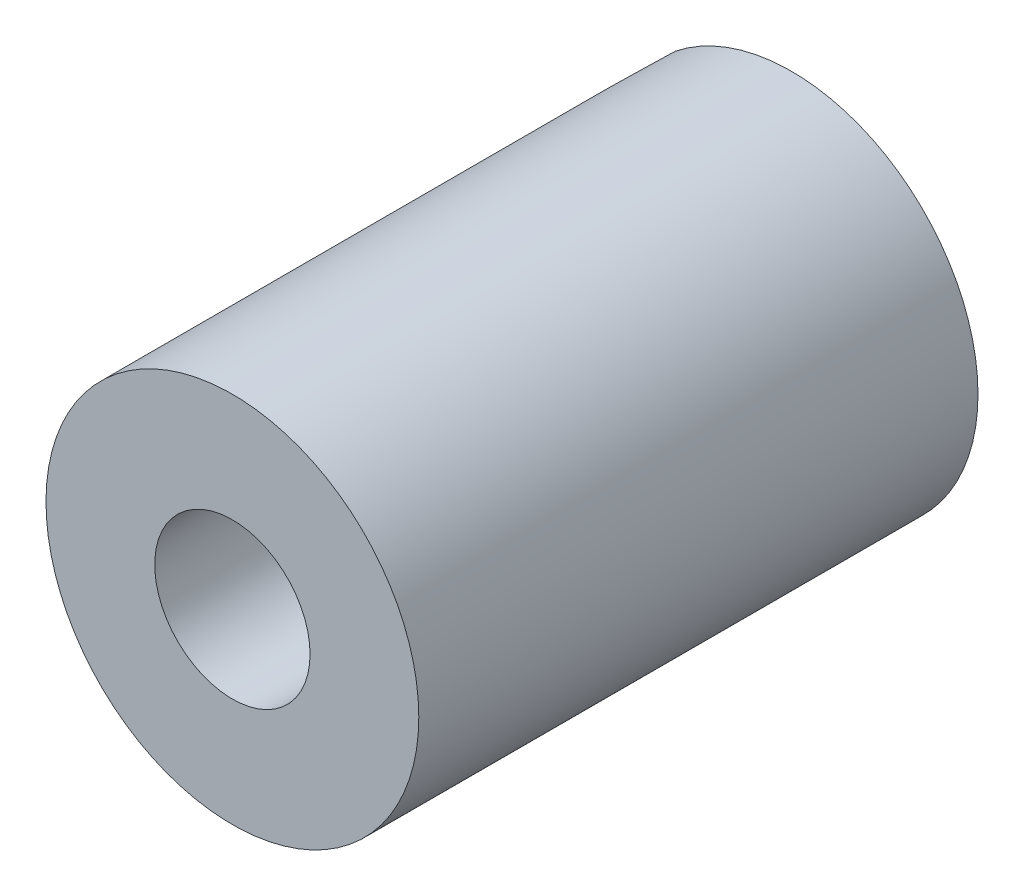
ISO-10303-21;
HEADER;
FILE_DESCRIPTION(('STEP AP214'),'2;1');
FILE_NAME('part.step','',(''),(''),'','','');
FILE_SCHEMA(('AUTOMOTIVE_DESIGN { 1 0 10303 214 1 1 1 1 }'));
ENDSEC;
DATA;
#1=APPLICATION_CONTEXT('core data for automotive mechanical design processes');
#2=APPLICATION_PROTOCOL_DEFINITION('international standard','automotive_design',2000,#1);
#3=PRODUCT_CONTEXT('',#1,'mechanical');
#4=PRODUCT('Part','Part','',(#3));
#5=PRODUCT_RELATED_PRODUCT_CATEGORY('part','',(#4));
#6=PRODUCT_DEFINITION_FORMATION('','',#4);
#7=PRODUCT_DEFINITION_CONTEXT('part definition',#1,'design');
#8=PRODUCT_DEFINITION('design','',#6,#7);
#9=PRODUCT_DEFINITION_SHAPE('','',#8);
#10=(LENGTH_UNIT() NAMED_UNIT(*) SI_UNIT(.MILLI.,.METRE.));
#11=(NAMED_UNIT(*) PLANE_ANGLE_UNIT() SI_UNIT($,.RADIAN.));
#12=(NAMED_UNIT(*) SI_UNIT($,.STERADIAN.) SOLID_ANGLE_UNIT());
#13=UNCERTAINTY_MEASURE_WITH_UNIT(LENGTH_MEASURE(1.E-05),#10,'distance_accuracy_value','');
#14=(GEOMETRIC_REPRESENTATION_CONTEXT(3) GLOBAL_UNCERTAINTY_ASSIGNED_CONTEXT((#13)) GLOBAL_UNIT_ASSIGNED_CONTEXT((#10,
#11,#12)) REPRESENTATION_CONTEXT('',''));
#15=CARTESIAN_POINT('',(0.,0.,0.));
#16=DIRECTION('',(0.,0.,1.));
#17=DIRECTION('',(1.,0.,0.));
#18=AXIS2_PLACEMENT_3D('',#15,#16,#17);
#19=CARTESIAN_POINT('',(0.,0.,9.));
#20=DIRECTION('',(0.,0.,1.));
#21=DIRECTION('',(1.,0.,0.));
#22=AXIS2_PLACEMENT_3D('',#19,#20,#21);
#23=PLANE('',#22);
#24=CARTESIAN_POINT('',(0.,0.,9.));
#25=DIRECTION('',(0.,0.,1.));
#26=DIRECTION('',(1.,0.,0.));
#27=AXIS2_PLACEMENT_3D('',#24,#25,#26);
#28=CIRCLE('',#27,3.);
#29=CARTESIAN_POINT('',(3.,0.,9.));
#30=VERTEX_POINT('',#29);
#31=EDGE_CURVE('E47',#30,#30,#28,.T.);
#32=ORIENTED_EDGE('',*,*,#31,.T.);
#33=EDGE_LOOP('',(#32));
#34=FACE_BOUND('',#33,.T.);
#35=CARTESIAN_POINT('',(0.,0.,9.));
#36=DIRECTION('',(0.,0.,1.));
#37=DIRECTION('',(1.,0.,0.));
#38=AXIS2_PLACEMENT_3D('',#35,#36,#37);
#39=CIRCLE('',#38,1.25);
#40=CARTESIAN_POINT('',(1.25,0.,9.));
#41=VERTEX_POINT('',#40);
#42=EDGE_CURVE('E64',#41,#41,#39,.T.);
#43=ORIENTED_EDGE('',*,*,#42,.F.);
#44=EDGE_LOOP('',(#43));
#45=FACE_BOUND('',#44,.T.);
#46=ADVANCED_FACE('F34',(#34,#45),#23,.T.);
#47=CARTESIAN_POINT('',(0.,0.,0.));
#48=DIRECTION('',(0.,0.,1.));
#49=DIRECTION('',(1.,0.,0.));
#50=AXIS2_PLACEMENT_3D('',#47,#48,#49);
#51=PLANE('',#50);
#52=CARTESIAN_POINT('',(0.,0.,0.));
#53=DIRECTION('',(0.,0.,1.));
#54=DIRECTION('',(1.,0.,0.));
#55=AXIS2_PLACEMENT_3D('',#52,#53,#54);
#56=CIRCLE('',#55,3.);
#57=CARTESIAN_POINT('',(-1.87179676972449,-2.34443529508685,0.));
#58=VERTEX_POINT('',#57);
#59=CARTESIAN_POINT('',(-1.87179676972449,2.34443529508685,0.));
#60=VERTEX_POINT('',#59);
#61=EDGE_CURVE('E61',#58,#60,#56,.T.);
#62=ORIENTED_EDGE('',*,*,#61,.F.);
#63=DIRECTION('',(0.,1.,0.));
#64=VECTOR('',#63,1.);
#65=CARTESIAN_POINT('',(-1.87179676972449,-5.,0.));
#66=LINE('',#65,#64);
#67=EDGE_CURVE('E53',#58,#60,#66,.T.);
#68=ORIENTED_EDGE('',*,*,#67,.T.);
#69=EDGE_LOOP('',(#62,#68));
#70=FACE_BOUND('',#69,.T.);
#71=CARTESIAN_POINT('',(0.,0.,0.));
#72=DIRECTION('',(0.,0.,1.));
#73=DIRECTION('',(1.,0.,0.));
#74=AXIS2_PLACEMENT_3D('',#71,#72,#73);
#75=CIRCLE('',#74,1.25);
#76=CARTESIAN_POINT('',(1.25,0.,0.));
#77=VERTEX_POINT('',#76);
#78=EDGE_CURVE('E62',#77,#77,#75,.T.);
#79=ORIENTED_EDGE('',*,*,#78,.T.);
#80=EDGE_LOOP('',(#79));
#81=FACE_BOUND('',#80,.T.);
#82=ADVANCED_FACE('F59',(#70,#81),#51,.F.);
#83=CARTESIAN_POINT('',(0.,0.,9.));
#84=DIRECTION('',(0.,0.,-1.));
#85=DIRECTION('',(-1.,0.,0.));
#86=AXIS2_PLACEMENT_3D('',#83,#84,#85);
#87=CYLINDRICAL_SURFACE('',#86,3.);
#88=ORIENTED_EDGE('',*,*,#31,.F.);
#89=EDGE_LOOP('',(#88));
#90=FACE_BOUND('',#89,.T.);
#91=ORIENTED_EDGE('',*,*,#61,.T.);
#92=CARTESIAN_POINT('',(-1.87179676972449,2.34443529508685,0.));
#93=CARTESIAN_POINT('',(-1.88074933741455,2.33728476735633,0.0620287119447855));
#94=CARTESIAN_POINT('',(-1.89052352754949,2.32940024318606,0.123849734071447));
#95=CARTESIAN_POINT('',(-1.91168442466181,2.31206662503211,0.247001295833658));
#96=CARTESIAN_POINT('',(-1.92307131077382,2.30261735722047,0.308331780180762));
#97=CARTESIAN_POINT('',(-1.95965091415942,2.27173856414817,0.491701092775742));
#98=CARTESIAN_POINT('',(-1.98722610467206,2.2478061961511,0.612866108575726));
#99=CARTESIAN_POINT('',(-2.04865500421913,2.19197577646782,0.853353841995063));
#100=CARTESIAN_POINT('',(-2.08257962073946,2.15998619323443,0.972637395633714));
#101=CARTESIAN_POINT('',(-2.15575692995754,2.08695426949177,1.20659098829699));
#102=CARTESIAN_POINT('',(-2.1950039485214,2.04592154101209,1.32126577413539));
#103=CARTESIAN_POINT('',(-2.2876594193316,1.94230579072023,1.57120335151079));
#104=CARTESIAN_POINT('',(-2.34222033035107,1.87692043247359,1.70490939046505));
#105=CARTESIAN_POINT('',(-2.45471502076116,1.72716218952217,1.95914713615149));
#106=CARTESIAN_POINT('',(-2.51263409306936,1.64286805425286,2.07973048719967));
#107=CARTESIAN_POINT('',(-2.61544573046948,1.47214770903493,2.28044561594911));
#108=CARTESIAN_POINT('',(-2.66057774396084,1.38969054080827,2.36380501325348));
#109=CARTESIAN_POINT('',(-2.74668836332077,1.21059277110405,2.51640139639137));
#110=CARTESIAN_POINT('',(-2.78767013630481,1.11396312486803,2.58564919249606));
#111=CARTESIAN_POINT('',(-2.85504600114549,0.925675643199321,2.69607482691308));
#112=CARTESIAN_POINT('',(-2.8827380279114,0.836128321411231,2.74004697946733));
#113=CARTESIAN_POINT('',(-2.93040290622826,0.64960129701191,2.81441880968996));
#114=CARTESIAN_POINT('',(-2.95037915876362,0.552624891656832,2.84482446816152));
#115=CARTESIAN_POINT('',(-2.9808433301658,0.353244815605846,2.89078356069575));
#116=CARTESIAN_POINT('',(-2.99128641076997,0.250817871504164,2.90626682769241));
#117=CARTESIAN_POINT('',(-3.00145257635679,0.0442743823682046,2.92134403224051));
#118=CARTESIAN_POINT('',(-3.0011784648615,-0.0598417136754921,2.92094212521181));
#119=CARTESIAN_POINT('',(-2.99041047489795,-0.257849969657977,2.90496332657009));
#120=CARTESIAN_POINT('',(-2.98074120586819,-0.351890367711473,2.89061083634469));
#121=CARTESIAN_POINT('',(-2.95322434518918,-0.535833034951507,2.84913336300258));
#122=CARTESIAN_POINT('',(-2.93537682921355,-0.625735342419475,2.82200849806906));
#123=CARTESIAN_POINT('',(-2.89236028263366,-0.801670022479395,2.75518271882283));
#124=CARTESIAN_POINT('',(-2.86701128341652,-0.887538757482863,2.71517023960376));
#125=CARTESIAN_POINT('',(-2.81105915239756,-1.05140841560359,2.6242844725293));
#126=CARTESIAN_POINT('',(-2.7804537445764,-1.12940590715695,2.57340647758409));
#127=CARTESIAN_POINT('',(-2.7019054835963,-1.30882128555795,2.43826368554602));
#128=CARTESIAN_POINT('',(-2.65219226521181,-1.40576341074723,2.34907980435898));
#129=CARTESIAN_POINT('',(-2.55081138132965,-1.58233854439102,2.15587841747699));
#130=CARTESIAN_POINT('',(-2.49913995017046,-1.66193598557506,2.0518311422938));
#131=CARTESIAN_POINT('',(-2.41228665848174,-1.78459014669409,1.86435697965833));
#132=CARTESIAN_POINT('',(-2.37664733785864,-1.83156445851959,1.78363839342386));
#133=CARTESIAN_POINT('',(-2.30721864315838,-1.91828880208474,1.61760979533661));
#134=CARTESIAN_POINT('',(-2.27343014756656,-1.9580354236455,1.53229764061686));
#135=CARTESIAN_POINT('',(-2.20838691197256,-2.03111434254849,1.35782264399032));
#136=CARTESIAN_POINT('',(-2.17713775078872,-2.06443272668105,1.26865194990934));
#137=CARTESIAN_POINT('',(-2.11777326250348,-2.12528556751513,1.08733325030257));
#138=CARTESIAN_POINT('',(-2.08965900487323,-2.1528180531761,0.995184242470698));
#139=CARTESIAN_POINT('',(-2.02200952765732,-2.2169217359716,0.755536953329127));
#140=CARTESIAN_POINT('',(-1.98504187536684,-2.24976125677183,0.606292125241536));
#141=CARTESIAN_POINT('',(-1.93697014254126,-2.29097683044425,0.380119054834942));
#142=CARTESIAN_POINT('',(-1.92221745432244,-2.30334354311549,0.304628167943324));
#143=CARTESIAN_POINT('',(-1.89515854502282,-2.32565640085766,0.152865607953595));
#144=CARTESIAN_POINT('',(-1.88285194959216,-2.3356029163677,0.0765940562099234));
#145=CARTESIAN_POINT('',(-1.87179676972449,-2.34443529508685,0.));
#146=B_SPLINE_CURVE_WITH_KNOTS('',3,(#92,#93,#94,#95,#96,#97,#98,#99,#100,#101,#102,#103,#104,
#105,#106,#107,#108,#109,#110,#111,#112,#113,#114,#115,#116,#117,#118,#119,#120,#121,#122,#123,
#124,#125,#126,#127,#128,#129,#130,#131,#132,#133,#134,#135,#136,#137,#138,#139,#140,#141,#142,
#143,#144,#145),.UNSPECIFIED.,.F.,.F.,(4,2,2,2,2,2,2,2,2,2,2,2,2,2,2,2,2,2,2,2,2,2,2,2,2,2,4),
(0.,0.189214126545451,0.378449287078281,0.757685276919647,1.14144078857325,1.52479035403251,
1.9989363150249,2.4711430996845,2.84668264015802,3.22193340596128,3.53123893839577,
3.84040797810615,4.15102377979714,4.46155832770267,4.74709055173401,5.03262013377874,
5.32564830695443,5.61880368238392,6.03884962172351,6.45974897266493,6.75924882813487,
7.05888962945368,7.35917186833591,7.65955623698125,8.13032940231002,8.36398761707545,
8.5976100452252),.UNSPECIFIED.);
#147=EDGE_CURVE('E11',#60,#58,#146,.T.);
#148=ORIENTED_EDGE('',*,*,#147,.T.);
#149=EDGE_LOOP('',(#91,#148));
#150=FACE_BOUND('',#149,.T.);
#151=ADVANCED_FACE('F36',(#90,#150),#87,.T.);
#152=CARTESIAN_POINT('',(0.,0.,9.));
#153=DIRECTION('',(0.,0.,-1.));
#154=DIRECTION('',(-1.,0.,0.));
#155=AXIS2_PLACEMENT_3D('',#152,#153,#154);
#156=CYLINDRICAL_SURFACE('',#155,1.25);
#157=ORIENTED_EDGE('',*,*,#42,.T.);
#158=EDGE_LOOP('',(#157));
#159=FACE_BOUND('',#158,.T.);
#160=ORIENTED_EDGE('',*,*,#78,.F.);
#161=EDGE_LOOP('',(#160));
#162=FACE_BOUND('',#161,.T.);
#163=ADVANCED_FACE('F73',(#159,#162),#156,.F.);
#164=CARTESIAN_POINT('',(-8.8,-5.,-1.));
#165=DIRECTION('',(0.,1.,0.));
#166=DIRECTION('',(0.,0.,1.));
#167=AXIS2_PLACEMENT_3D('',#164,#165,#166);
#168=CYLINDRICAL_SURFACE('',#167,7.);
#169=ORIENTED_EDGE('',*,*,#147,.F.);
#170=ORIENTED_EDGE('',*,*,#67,.F.);
#171=EDGE_LOOP('',(#169,#170));
#172=FACE_BOUND('',#171,.T.);
#173=ADVANCED_FACE('F54',(#172),#168,.F.);
#174=CLOSED_SHELL('',(#46,#82,#151,#163,#173));
#175=MANIFOLD_SOLID_BREP('B2',#174);
#176=ADVANCED_BREP_SHAPE_REPRESENTATION('',(#18,#175),#14);
#177=SHAPE_DEFINITION_REPRESENTATION(#9,#176);
ENDSEC;
END-ISO-10303-21;
